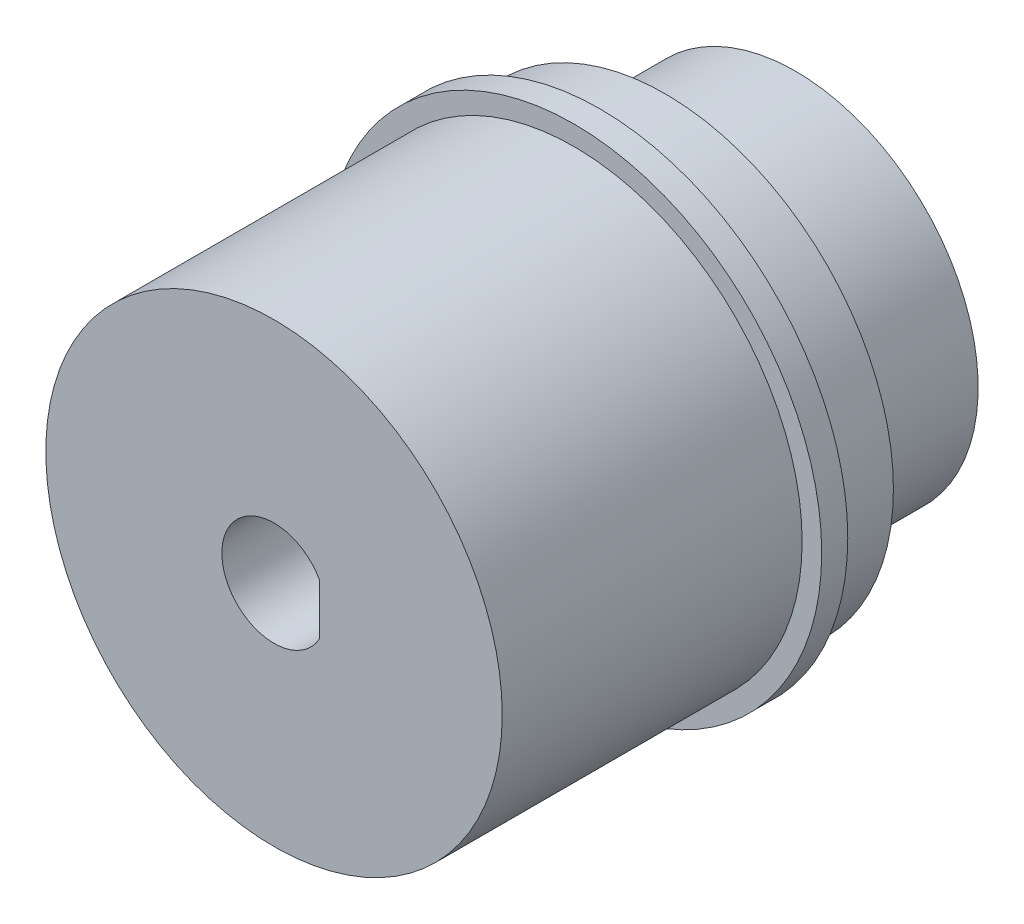
ISO-10303-21;
HEADER;
FILE_DESCRIPTION(('STEP AP214'),'2;1');
FILE_NAME('part.step','',(''),(''),'','','');
FILE_SCHEMA(('AUTOMOTIVE_DESIGN { 1 0 10303 214 1 1 1 1 }'));
ENDSEC;
DATA;
#1=APPLICATION_CONTEXT('core data for automotive mechanical design processes');
#2=APPLICATION_PROTOCOL_DEFINITION('international standard','automotive_design',2000,#1);
#3=PRODUCT_CONTEXT('',#1,'mechanical');
#4=PRODUCT('Part','Part','',(#3));
#5=PRODUCT_RELATED_PRODUCT_CATEGORY('part','',(#4));
#6=PRODUCT_DEFINITION_FORMATION('','',#4);
#7=PRODUCT_DEFINITION_CONTEXT('part definition',#1,'design');
#8=PRODUCT_DEFINITION('design','',#6,#7);
#9=PRODUCT_DEFINITION_SHAPE('','',#8);
#10=(LENGTH_UNIT() NAMED_UNIT(*) SI_UNIT(.MILLI.,.METRE.));
#11=(NAMED_UNIT(*) PLANE_ANGLE_UNIT() SI_UNIT($,.RADIAN.));
#12=(NAMED_UNIT(*) SI_UNIT($,.STERADIAN.) SOLID_ANGLE_UNIT());
#13=UNCERTAINTY_MEASURE_WITH_UNIT(LENGTH_MEASURE(1.E-05),#10,'distance_accuracy_value','');
#14=(GEOMETRIC_REPRESENTATION_CONTEXT(3) GLOBAL_UNCERTAINTY_ASSIGNED_CONTEXT((#13)) GLOBAL_UNIT_ASSIGNED_CONTEXT((#10,
#11,#12)) REPRESENTATION_CONTEXT('',''));
#15=CARTESIAN_POINT('',(0.,0.,0.));
#16=DIRECTION('',(0.,0.,1.));
#17=DIRECTION('',(1.,0.,0.));
#18=AXIS2_PLACEMENT_3D('',#15,#16,#17);
#19=CARTESIAN_POINT('',(0.,0.,10.));
#20=DIRECTION('',(0.,0.,-1.));
#21=DIRECTION('',(-1.,0.,0.));
#22=AXIS2_PLACEMENT_3D('',#19,#20,#21);
#23=CYLINDRICAL_SURFACE('',#22,14.);
#24=DIRECTION('',(0.,0.,-1.));
#25=VECTOR('',#24,1.);
#26=CARTESIAN_POINT('',(-10.,9.79795897113271,10.));
#27=LINE('',#26,#25);
#28=CARTESIAN_POINT('',(-10.,9.79795897113271,10.));
#29=VERTEX_POINT('',#28);
#30=CARTESIAN_POINT('',(-10.,9.79795897113271,0.));
#31=VERTEX_POINT('',#30);
#32=EDGE_CURVE('E123',#29,#31,#27,.T.);
#33=ORIENTED_EDGE('',*,*,#32,.F.);
#34=CARTESIAN_POINT('',(0.,0.,10.));
#35=DIRECTION('',(0.,0.,1.));
#36=DIRECTION('',(1.,0.,0.));
#37=AXIS2_PLACEMENT_3D('',#34,#35,#36);
#38=CIRCLE('',#37,14.);
#39=CARTESIAN_POINT('',(-10.,-9.79795897113271,10.));
#40=VERTEX_POINT('',#39);
#41=EDGE_CURVE('E48',#40,#29,#38,.T.);
#42=ORIENTED_EDGE('',*,*,#41,.F.);
#43=DIRECTION('',(0.,0.,-1.));
#44=VECTOR('',#43,1.);
#45=CARTESIAN_POINT('',(-10.,-9.79795897113271,10.));
#46=LINE('',#45,#44);
#47=CARTESIAN_POINT('',(-10.,-9.79795897113271,0.));
#48=VERTEX_POINT('',#47);
#49=EDGE_CURVE('E119',#40,#48,#46,.T.);
#50=ORIENTED_EDGE('',*,*,#49,.T.);
#51=CARTESIAN_POINT('',(0.,0.,0.));
#52=DIRECTION('',(0.,0.,1.));
#53=DIRECTION('',(1.,0.,0.));
#54=AXIS2_PLACEMENT_3D('',#51,#52,#53);
#55=CIRCLE('',#54,14.);
#56=EDGE_CURVE('E42',#48,#31,#55,.T.);
#57=ORIENTED_EDGE('',*,*,#56,.T.);
#58=EDGE_LOOP('',(#33,#42,#50,#57));
#59=FACE_BOUND('',#58,.T.);
#60=ADVANCED_FACE('F39',(#59),#23,.T.);
#61=CARTESIAN_POINT('',(0.,0.,0.));
#62=DIRECTION('',(0.,0.,1.));
#63=DIRECTION('',(1.,0.,0.));
#64=AXIS2_PLACEMENT_3D('',#61,#62,#63);
#65=PLANE('',#64);
#66=CARTESIAN_POINT('',(0.,0.,0.));
#67=DIRECTION('',(0.,0.,-1.));
#68=DIRECTION('',(-1.,0.,0.));
#69=AXIS2_PLACEMENT_3D('',#66,#67,#68);
#70=CIRCLE('',#69,2.75);
#71=CARTESIAN_POINT('',(-2.75,0.,0.));
#72=VERTEX_POINT('',#71);
#73=EDGE_CURVE('E107',#72,#72,#70,.T.);
#74=ORIENTED_EDGE('',*,*,#73,.F.);
#75=EDGE_LOOP('',(#74));
#76=FACE_BOUND('',#75,.T.);
#77=DIRECTION('',(0.,1.,0.));
#78=VECTOR('',#77,1.);
#79=CARTESIAN_POINT('',(-10.,0.,0.));
#80=LINE('',#79,#78);
#81=EDGE_CURVE('E113',#48,#31,#80,.T.);
#82=ORIENTED_EDGE('',*,*,#81,.T.);
#83=ORIENTED_EDGE('',*,*,#56,.F.);
#84=EDGE_LOOP('',(#82,#83));
#85=FACE_BOUND('',#84,.T.);
#86=ADVANCED_FACE('F156',(#76,#85),#65,.F.);
#87=CARTESIAN_POINT('',(0.,0.,15.));
#88=DIRECTION('',(0.,0.,-1.));
#89=DIRECTION('',(-1.,0.,0.));
#90=AXIS2_PLACEMENT_3D('',#87,#88,#89);
#91=CYLINDRICAL_SURFACE('',#90,17.5);
#92=CARTESIAN_POINT('',(0.,0.,15.));
#93=DIRECTION('',(0.,0.,1.));
#94=DIRECTION('',(1.,0.,0.));
#95=AXIS2_PLACEMENT_3D('',#92,#93,#94);
#96=CIRCLE('',#95,17.5);
#97=CARTESIAN_POINT('',(17.5,0.,15.));
#98=VERTEX_POINT('',#97);
#99=EDGE_CURVE('E142',#98,#98,#96,.T.);
#100=ORIENTED_EDGE('',*,*,#99,.F.);
#101=EDGE_LOOP('',(#100));
#102=FACE_BOUND('',#101,.T.);
#103=CARTESIAN_POINT('',(0.,0.,10.));
#104=DIRECTION('',(0.,0.,1.));
#105=DIRECTION('',(1.,0.,0.));
#106=AXIS2_PLACEMENT_3D('',#103,#104,#105);
#107=CIRCLE('',#106,17.5);
#108=CARTESIAN_POINT('',(17.5,0.,10.));
#109=VERTEX_POINT('',#108);
#110=EDGE_CURVE('E138',#109,#109,#107,.T.);
#111=ORIENTED_EDGE('',*,*,#110,.T.);
#112=EDGE_LOOP('',(#111));
#113=FACE_BOUND('',#112,.T.);
#114=ADVANCED_FACE('F177',(#102,#113),#91,.T.);
#115=CARTESIAN_POINT('',(0.,0.,10.));
#116=DIRECTION('',(0.,0.,1.));
#117=DIRECTION('',(1.,0.,0.));
#118=AXIS2_PLACEMENT_3D('',#115,#116,#117);
#119=PLANE('',#118);
#120=ORIENTED_EDGE('',*,*,#41,.T.);
#121=DIRECTION('',(0.,1.,0.));
#122=VECTOR('',#121,1.);
#123=CARTESIAN_POINT('',(-10.,0.,10.));
#124=LINE('',#123,#122);
#125=EDGE_CURVE('E63',#40,#29,#124,.T.);
#126=ORIENTED_EDGE('',*,*,#125,.F.);
#127=EDGE_LOOP('',(#120,#126));
#128=FACE_BOUND('',#127,.T.);
#129=ORIENTED_EDGE('',*,*,#110,.F.);
#130=EDGE_LOOP('',(#129));
#131=FACE_BOUND('',#130,.T.);
#132=ADVANCED_FACE('F182',(#128,#131),#119,.F.);
#133=CARTESIAN_POINT('',(0.,0.,17.));
#134=DIRECTION('',(0.,0.,-1.));
#135=DIRECTION('',(-1.,0.,0.));
#136=AXIS2_PLACEMENT_3D('',#133,#134,#135);
#137=CYLINDRICAL_SURFACE('',#136,19.);
#138=CARTESIAN_POINT('',(0.,0.,17.));
#139=DIRECTION('',(0.,0.,1.));
#140=DIRECTION('',(1.,0.,0.));
#141=AXIS2_PLACEMENT_3D('',#138,#139,#140);
#142=CIRCLE('',#141,19.);
#143=CARTESIAN_POINT('',(19.,0.,17.));
#144=VERTEX_POINT('',#143);
#145=EDGE_CURVE('E134',#144,#144,#142,.T.);
#146=ORIENTED_EDGE('',*,*,#145,.F.);
#147=EDGE_LOOP('',(#146));
#148=FACE_BOUND('',#147,.T.);
#149=CARTESIAN_POINT('',(0.,0.,15.));
#150=DIRECTION('',(0.,0.,1.));
#151=DIRECTION('',(1.,0.,0.));
#152=AXIS2_PLACEMENT_3D('',#149,#150,#151);
#153=CIRCLE('',#152,19.);
#154=CARTESIAN_POINT('',(19.,0.,15.));
#155=VERTEX_POINT('',#154);
#156=EDGE_CURVE('E132',#155,#155,#153,.T.);
#157=ORIENTED_EDGE('',*,*,#156,.T.);
#158=EDGE_LOOP('',(#157));
#159=FACE_BOUND('',#158,.T.);
#160=ADVANCED_FACE('F189',(#148,#159),#137,.T.);
#161=CARTESIAN_POINT('',(0.,0.,17.));
#162=DIRECTION('',(0.,0.,1.));
#163=DIRECTION('',(1.,0.,0.));
#164=AXIS2_PLACEMENT_3D('',#161,#162,#163);
#165=PLANE('',#164);
#166=CARTESIAN_POINT('',(0.,0.,17.));
#167=DIRECTION('',(0.,0.,1.));
#168=DIRECTION('',(1.,0.,0.));
#169=AXIS2_PLACEMENT_3D('',#166,#167,#168);
#170=CIRCLE('',#169,17.5);
#171=CARTESIAN_POINT('',(17.5,0.,17.));
#172=VERTEX_POINT('',#171);
#173=EDGE_CURVE('E11',#172,#172,#170,.T.);
#174=ORIENTED_EDGE('',*,*,#173,.F.);
#175=EDGE_LOOP('',(#174));
#176=FACE_BOUND('',#175,.T.);
#177=ORIENTED_EDGE('',*,*,#145,.T.);
#178=EDGE_LOOP('',(#177));
#179=FACE_BOUND('',#178,.T.);
#180=ADVANCED_FACE('F192',(#176,#179),#165,.T.);
#181=CARTESIAN_POINT('',(0.,0.,15.));
#182=DIRECTION('',(0.,0.,1.));
#183=DIRECTION('',(1.,0.,0.));
#184=AXIS2_PLACEMENT_3D('',#181,#182,#183);
#185=PLANE('',#184);
#186=ORIENTED_EDGE('',*,*,#99,.T.);
#187=EDGE_LOOP('',(#186));
#188=FACE_BOUND('',#187,.T.);
#189=ORIENTED_EDGE('',*,*,#156,.F.);
#190=EDGE_LOOP('',(#189));
#191=FACE_BOUND('',#190,.T.);
#192=ADVANCED_FACE('F194',(#188,#191),#185,.F.);
#193=CARTESIAN_POINT('',(0.,0.,40.));
#194=DIRECTION('',(0.,0.,-1.));
#195=DIRECTION('',(-1.,0.,0.));
#196=AXIS2_PLACEMENT_3D('',#193,#194,#195);
#197=CYLINDRICAL_SURFACE('',#196,17.5);
#198=CARTESIAN_POINT('',(0.,0.,40.));
#199=DIRECTION('',(0.,0.,1.));
#200=DIRECTION('',(1.,0.,0.));
#201=AXIS2_PLACEMENT_3D('',#198,#199,#200);
#202=CIRCLE('',#201,17.5);
#203=CARTESIAN_POINT('',(17.5,0.,40.));
#204=VERTEX_POINT('',#203);
#205=EDGE_CURVE('E126',#204,#204,#202,.T.);
#206=ORIENTED_EDGE('',*,*,#205,.F.);
#207=EDGE_LOOP('',(#206));
#208=FACE_BOUND('',#207,.T.);
#209=ORIENTED_EDGE('',*,*,#173,.T.);
#210=EDGE_LOOP('',(#209));
#211=FACE_BOUND('',#210,.T.);
#212=ADVANCED_FACE('F170',(#208,#211),#197,.T.);
#213=CARTESIAN_POINT('',(0.,0.,40.));
#214=DIRECTION('',(0.,0.,1.));
#215=DIRECTION('',(1.,0.,0.));
#216=AXIS2_PLACEMENT_3D('',#213,#214,#215);
#217=PLANE('',#216);
#218=DIRECTION('',(0.,1.,0.));
#219=VECTOR('',#218,1.);
#220=CARTESIAN_POINT('',(3.5,0.,40.));
#221=LINE('',#220,#219);
#222=CARTESIAN_POINT('',(3.5,-1.93649167310371,40.));
#223=VERTEX_POINT('',#222);
#224=CARTESIAN_POINT('',(3.5,1.93649167310371,40.));
#225=VERTEX_POINT('',#224);
#226=EDGE_CURVE('E86',#223,#225,#221,.T.);
#227=ORIENTED_EDGE('',*,*,#226,.F.);
#228=CARTESIAN_POINT('',(0.,0.,40.));
#229=DIRECTION('',(0.,0.,1.));
#230=DIRECTION('',(1.,0.,0.));
#231=AXIS2_PLACEMENT_3D('',#228,#229,#230);
#232=CIRCLE('',#231,4.);
#233=EDGE_CURVE('E101',#225,#223,#232,.T.);
#234=ORIENTED_EDGE('',*,*,#233,.F.);
#235=EDGE_LOOP('',(#227,#234));
#236=FACE_BOUND('',#235,.T.);
#237=ORIENTED_EDGE('',*,*,#205,.T.);
#238=EDGE_LOOP('',(#237));
#239=FACE_BOUND('',#238,.T.);
#240=ADVANCED_FACE('F161',(#236,#239),#217,.T.);
#241=CARTESIAN_POINT('',(-10.,0.,10.));
#242=DIRECTION('',(-1.,0.,0.));
#243=DIRECTION('',(0.,0.,1.));
#244=AXIS2_PLACEMENT_3D('',#241,#242,#243);
#245=PLANE('',#244);
#246=ORIENTED_EDGE('',*,*,#81,.F.);
#247=ORIENTED_EDGE('',*,*,#49,.F.);
#248=ORIENTED_EDGE('',*,*,#125,.T.);
#249=ORIENTED_EDGE('',*,*,#32,.T.);
#250=EDGE_LOOP('',(#246,#247,#248,#249));
#251=FACE_BOUND('',#250,.T.);
#252=ADVANCED_FACE('F158',(#251),#245,.T.);
#253=CARTESIAN_POINT('',(0.,0.,15.));
#254=DIRECTION('',(0.,0.,-1.));
#255=DIRECTION('',(-1.,0.,0.));
#256=AXIS2_PLACEMENT_3D('',#253,#254,#255);
#257=CYLINDRICAL_SURFACE('',#256,2.75);
#258=CARTESIAN_POINT('',(0.,0.,15.));
#259=DIRECTION('',(0.,0.,-1.));
#260=DIRECTION('',(-1.,0.,0.));
#261=AXIS2_PLACEMENT_3D('',#258,#259,#260);
#262=CIRCLE('',#261,2.75);
#263=CARTESIAN_POINT('',(-2.75,0.,15.));
#264=VERTEX_POINT('',#263);
#265=EDGE_CURVE('E109',#264,#264,#262,.T.);
#266=ORIENTED_EDGE('',*,*,#265,.F.);
#267=EDGE_LOOP('',(#266));
#268=FACE_BOUND('',#267,.T.);
#269=ORIENTED_EDGE('',*,*,#73,.T.);
#270=EDGE_LOOP('',(#269));
#271=FACE_BOUND('',#270,.T.);
#272=ADVANCED_FACE('F160',(#268,#271),#257,.F.);
#273=CARTESIAN_POINT('',(0.,0.,15.));
#274=DIRECTION('',(0.,0.,-1.));
#275=DIRECTION('',(-1.,0.,0.));
#276=AXIS2_PLACEMENT_3D('',#273,#274,#275);
#277=PLANE('',#276);
#278=ORIENTED_EDGE('',*,*,#265,.T.);
#279=EDGE_LOOP('',(#278));
#280=FACE_BOUND('',#279,.T.);
#281=ADVANCED_FACE('F167',(#280),#277,.T.);
#282=CARTESIAN_POINT('',(3.5,0.,25.));
#283=DIRECTION('',(1.,0.,0.));
#284=DIRECTION('',(0.,0.,-1.));
#285=AXIS2_PLACEMENT_3D('',#282,#283,#284);
#286=PLANE('',#285);
#287=ORIENTED_EDGE('',*,*,#226,.T.);
#288=DIRECTION('',(0.,0.,1.));
#289=VECTOR('',#288,1.);
#290=CARTESIAN_POINT('',(3.5,1.93649167310371,25.));
#291=LINE('',#290,#289);
#292=CARTESIAN_POINT('',(3.5,1.93649167310371,25.));
#293=VERTEX_POINT('',#292);
#294=EDGE_CURVE('E56',#293,#225,#291,.T.);
#295=ORIENTED_EDGE('',*,*,#294,.F.);
#296=DIRECTION('',(0.,1.,0.));
#297=VECTOR('',#296,1.);
#298=CARTESIAN_POINT('',(3.5,0.,25.));
#299=LINE('',#298,#297);
#300=CARTESIAN_POINT('',(3.5,-1.93649167310371,25.));
#301=VERTEX_POINT('',#300);
#302=EDGE_CURVE('E83',#301,#293,#299,.T.);
#303=ORIENTED_EDGE('',*,*,#302,.F.);
#304=DIRECTION('',(0.,0.,1.));
#305=VECTOR('',#304,1.);
#306=CARTESIAN_POINT('',(3.5,-1.93649167310371,25.));
#307=LINE('',#306,#305);
#308=EDGE_CURVE('E89',#301,#223,#307,.T.);
#309=ORIENTED_EDGE('',*,*,#308,.T.);
#310=EDGE_LOOP('',(#287,#295,#303,#309));
#311=FACE_BOUND('',#310,.T.);
#312=ADVANCED_FACE('F81',(#311),#286,.F.);
#313=CARTESIAN_POINT('',(0.,0.,25.));
#314=DIRECTION('',(0.,0.,1.));
#315=DIRECTION('',(1.,0.,0.));
#316=AXIS2_PLACEMENT_3D('',#313,#314,#315);
#317=CYLINDRICAL_SURFACE('',#316,4.);
#318=ORIENTED_EDGE('',*,*,#233,.T.);
#319=ORIENTED_EDGE('',*,*,#308,.F.);
#320=CARTESIAN_POINT('',(0.,0.,25.));
#321=DIRECTION('',(0.,0.,1.));
#322=DIRECTION('',(1.,0.,0.));
#323=AXIS2_PLACEMENT_3D('',#320,#321,#322);
#324=CIRCLE('',#323,4.);
#325=EDGE_CURVE('E90',#293,#301,#324,.T.);
#326=ORIENTED_EDGE('',*,*,#325,.F.);
#327=ORIENTED_EDGE('',*,*,#294,.T.);
#328=EDGE_LOOP('',(#318,#319,#326,#327));
#329=FACE_BOUND('',#328,.T.);
#330=ADVANCED_FACE('F93',(#329),#317,.F.);
#331=CARTESIAN_POINT('',(0.,0.,25.));
#332=DIRECTION('',(0.,0.,1.));
#333=DIRECTION('',(1.,0.,0.));
#334=AXIS2_PLACEMENT_3D('',#331,#332,#333);
#335=PLANE('',#334);
#336=ORIENTED_EDGE('',*,*,#302,.T.);
#337=ORIENTED_EDGE('',*,*,#325,.T.);
#338=EDGE_LOOP('',(#336,#337));
#339=FACE_BOUND('',#338,.T.);
#340=ADVANCED_FACE('F97',(#339),#335,.T.);
#341=CLOSED_SHELL('',(#60,#86,#114,#132,#160,#180,#192,#212,#240,#252,#272,#281,#312,#330,#340));
#342=MANIFOLD_SOLID_BREP('B2',#341);
#343=ADVANCED_BREP_SHAPE_REPRESENTATION('',(#18,#342),#14);
#344=SHAPE_DEFINITION_REPRESENTATION(#9,#343);
ENDSEC;
END-ISO-10303-21;
